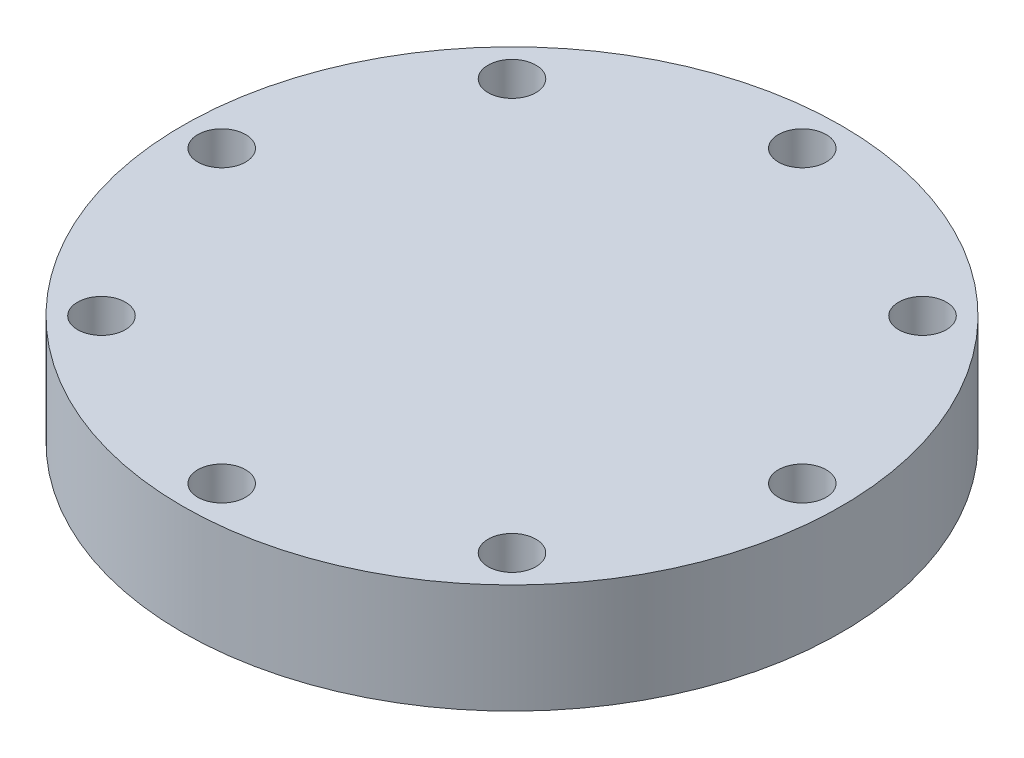
ISO-10303-21;
HEADER;
FILE_DESCRIPTION(('STEP AP214'),'2;1');
FILE_NAME('part.step','',(''),(''),'','','');
FILE_SCHEMA(('AUTOMOTIVE_DESIGN { 1 0 10303 214 1 1 1 1 }'));
ENDSEC;
DATA;
#1=APPLICATION_CONTEXT('core data for automotive mechanical design processes');
#2=APPLICATION_PROTOCOL_DEFINITION('international standard','automotive_design',2000,#1);
#3=PRODUCT_CONTEXT('',#1,'mechanical');
#4=PRODUCT('Part','Part','',(#3));
#5=PRODUCT_RELATED_PRODUCT_CATEGORY('part','',(#4));
#6=PRODUCT_DEFINITION_FORMATION('','',#4);
#7=PRODUCT_DEFINITION_CONTEXT('part definition',#1,'design');
#8=PRODUCT_DEFINITION('design','',#6,#7);
#9=PRODUCT_DEFINITION_SHAPE('','',#8);
#10=(LENGTH_UNIT() NAMED_UNIT(*) SI_UNIT(.MILLI.,.METRE.));
#11=(NAMED_UNIT(*) PLANE_ANGLE_UNIT() SI_UNIT($,.RADIAN.));
#12=(NAMED_UNIT(*) SI_UNIT($,.STERADIAN.) SOLID_ANGLE_UNIT());
#13=UNCERTAINTY_MEASURE_WITH_UNIT(LENGTH_MEASURE(1.E-05),#10,'distance_accuracy_value','');
#14=(GEOMETRIC_REPRESENTATION_CONTEXT(3) GLOBAL_UNCERTAINTY_ASSIGNED_CONTEXT((#13)) GLOBAL_UNIT_ASSIGNED_CONTEXT((#10,
#11,#12)) REPRESENTATION_CONTEXT('',''));
#15=CARTESIAN_POINT('',(0.,0.,0.));
#16=DIRECTION('',(0.,0.,1.));
#17=DIRECTION('',(1.,0.,0.));
#18=AXIS2_PLACEMENT_3D('',#15,#16,#17);
#19=CARTESIAN_POINT('',(-30.0520382004282,-8.00000000000001,30.0520382004283));
#20=DIRECTION('',(0.,1.,0.));
#21=DIRECTION('',(0.,0.,1.));
#22=AXIS2_PLACEMENT_3D('',#19,#20,#21);
#23=CYLINDRICAL_SURFACE('',#22,2.);
#24=CARTESIAN_POINT('',(-30.0520382004282,0.,30.0520382004283));
#25=DIRECTION('',(0.,1.,0.));
#26=DIRECTION('',(0.,0.,1.));
#27=AXIS2_PLACEMENT_3D('',#24,#25,#26);
#28=CIRCLE('',#27,2.);
#29=CARTESIAN_POINT('',(-30.0520382004282,0.,32.0520382004283));
#30=VERTEX_POINT('',#29);
#31=EDGE_CURVE('E57',#30,#30,#28,.T.);
#32=ORIENTED_EDGE('',*,*,#31,.F.);
#33=EDGE_LOOP('',(#32));
#34=FACE_BOUND('',#33,.T.);
#35=CARTESIAN_POINT('',(-30.0520382004282,6.,30.0520382004283));
#36=DIRECTION('',(0.,1.,0.));
#37=DIRECTION('',(0.,0.,1.));
#38=AXIS2_PLACEMENT_3D('',#35,#36,#37);
#39=CIRCLE('',#38,2.);
#40=CARTESIAN_POINT('',(-30.0520382004282,6.,32.0520382004283));
#41=VERTEX_POINT('',#40);
#42=EDGE_CURVE('E41',#41,#41,#39,.F.);
#43=ORIENTED_EDGE('',*,*,#42,.F.);
#44=EDGE_LOOP('',(#43));
#45=FACE_BOUND('',#44,.T.);
#46=ADVANCED_FACE('F37',(#34,#45),#23,.F.);
#47=CARTESIAN_POINT('',(-30.0520382004286,-8.00000000000001,-30.0520382004279));
#48=DIRECTION('',(0.,1.,0.));
#49=DIRECTION('',(0.,0.,1.));
#50=AXIS2_PLACEMENT_3D('',#47,#48,#49);
#51=CYLINDRICAL_SURFACE('',#50,2.);
#52=CARTESIAN_POINT('',(-30.0520382004286,0.,-30.0520382004279));
#53=DIRECTION('',(0.,1.,0.));
#54=DIRECTION('',(0.,0.,1.));
#55=AXIS2_PLACEMENT_3D('',#52,#53,#54);
#56=CIRCLE('',#55,2.);
#57=CARTESIAN_POINT('',(-30.0520382004286,0.,-28.0520382004279));
#58=VERTEX_POINT('',#57);
#59=EDGE_CURVE('E60',#58,#58,#56,.T.);
#60=ORIENTED_EDGE('',*,*,#59,.F.);
#61=EDGE_LOOP('',(#60));
#62=FACE_BOUND('',#61,.T.);
#63=CARTESIAN_POINT('',(-30.0520382004286,6.,-30.0520382004279));
#64=DIRECTION('',(0.,1.,0.));
#65=DIRECTION('',(0.,0.,1.));
#66=AXIS2_PLACEMENT_3D('',#63,#64,#65);
#67=CIRCLE('',#66,2.);
#68=CARTESIAN_POINT('',(-30.0520382004286,6.,-28.0520382004279));
#69=VERTEX_POINT('',#68);
#70=EDGE_CURVE('E96',#69,#69,#67,.F.);
#71=ORIENTED_EDGE('',*,*,#70,.F.);
#72=EDGE_LOOP('',(#71));
#73=FACE_BOUND('',#72,.T.);
#74=ADVANCED_FACE('F199',(#62,#73),#51,.F.);
#75=CARTESIAN_POINT('',(-4.451638707025E-13,-8.00000000000001,-42.5));
#76=DIRECTION('',(0.,1.,0.));
#77=DIRECTION('',(0.,0.,1.));
#78=AXIS2_PLACEMENT_3D('',#75,#76,#77);
#79=CYLINDRICAL_SURFACE('',#78,2.);
#80=CARTESIAN_POINT('',(-4.451638707025E-13,0.,-42.5));
#81=DIRECTION('',(0.,1.,0.));
#82=DIRECTION('',(0.,0.,1.));
#83=AXIS2_PLACEMENT_3D('',#80,#81,#82);
#84=CIRCLE('',#83,2.);
#85=CARTESIAN_POINT('',(-4.451638707025E-13,0.,-40.5));
#86=VERTEX_POINT('',#85);
#87=EDGE_CURVE('E64',#86,#86,#84,.T.);
#88=ORIENTED_EDGE('',*,*,#87,.F.);
#89=EDGE_LOOP('',(#88));
#90=FACE_BOUND('',#89,.T.);
#91=CARTESIAN_POINT('',(-4.451638707025E-13,6.,-42.5));
#92=DIRECTION('',(0.,1.,0.));
#93=DIRECTION('',(0.,0.,1.));
#94=AXIS2_PLACEMENT_3D('',#91,#92,#93);
#95=CIRCLE('',#94,2.);
#96=CARTESIAN_POINT('',(-4.451638707025E-13,6.,-40.5));
#97=VERTEX_POINT('',#96);
#98=EDGE_CURVE('E94',#97,#97,#95,.F.);
#99=ORIENTED_EDGE('',*,*,#98,.F.);
#100=EDGE_LOOP('',(#99));
#101=FACE_BOUND('',#100,.T.);
#102=ADVANCED_FACE('F206',(#90,#101),#79,.F.);
#103=CARTESIAN_POINT('',(30.052038200428,-8.00000000000001,-30.0520382004285));
#104=DIRECTION('',(0.,1.,0.));
#105=DIRECTION('',(0.,0.,1.));
#106=AXIS2_PLACEMENT_3D('',#103,#104,#105);
#107=CYLINDRICAL_SURFACE('',#106,2.);
#108=CARTESIAN_POINT('',(30.052038200428,0.,-30.0520382004285));
#109=DIRECTION('',(0.,1.,0.));
#110=DIRECTION('',(0.,0.,1.));
#111=AXIS2_PLACEMENT_3D('',#108,#109,#110);
#112=CIRCLE('',#111,2.);
#113=CARTESIAN_POINT('',(30.052038200428,0.,-28.0520382004285));
#114=VERTEX_POINT('',#113);
#115=EDGE_CURVE('E67',#114,#114,#112,.T.);
#116=ORIENTED_EDGE('',*,*,#115,.F.);
#117=EDGE_LOOP('',(#116));
#118=FACE_BOUND('',#117,.T.);
#119=CARTESIAN_POINT('',(30.052038200428,6.,-30.0520382004285));
#120=DIRECTION('',(0.,1.,0.));
#121=DIRECTION('',(0.,0.,1.));
#122=AXIS2_PLACEMENT_3D('',#119,#120,#121);
#123=CIRCLE('',#122,2.);
#124=CARTESIAN_POINT('',(30.052038200428,6.,-28.0520382004285));
#125=VERTEX_POINT('',#124);
#126=EDGE_CURVE('E91',#125,#125,#123,.F.);
#127=ORIENTED_EDGE('',*,*,#126,.F.);
#128=EDGE_LOOP('',(#127));
#129=FACE_BOUND('',#128,.T.);
#130=ADVANCED_FACE('F213',(#118,#129),#107,.F.);
#131=CARTESIAN_POINT('',(42.5,-8.00000000000001,0.));
#132=DIRECTION('',(0.,1.,0.));
#133=DIRECTION('',(0.,0.,1.));
#134=AXIS2_PLACEMENT_3D('',#131,#132,#133);
#135=CYLINDRICAL_SURFACE('',#134,2.);
#136=CARTESIAN_POINT('',(42.5,0.,0.));
#137=DIRECTION('',(0.,1.,0.));
#138=DIRECTION('',(0.,0.,1.));
#139=AXIS2_PLACEMENT_3D('',#136,#137,#138);
#140=CIRCLE('',#139,2.);
#141=CARTESIAN_POINT('',(42.5,0.,2.));
#142=VERTEX_POINT('',#141);
#143=EDGE_CURVE('E70',#142,#142,#140,.T.);
#144=ORIENTED_EDGE('',*,*,#143,.F.);
#145=EDGE_LOOP('',(#144));
#146=FACE_BOUND('',#145,.T.);
#147=CARTESIAN_POINT('',(42.5,6.,0.));
#148=DIRECTION('',(0.,1.,0.));
#149=DIRECTION('',(0.,0.,1.));
#150=AXIS2_PLACEMENT_3D('',#147,#148,#149);
#151=CIRCLE('',#150,2.);
#152=CARTESIAN_POINT('',(42.5,6.,2.));
#153=VERTEX_POINT('',#152);
#154=EDGE_CURVE('E88',#153,#153,#151,.F.);
#155=ORIENTED_EDGE('',*,*,#154,.F.);
#156=EDGE_LOOP('',(#155));
#157=FACE_BOUND('',#156,.T.);
#158=ADVANCED_FACE('F269',(#146,#157),#135,.F.);
#159=CARTESIAN_POINT('',(30.0520382004284,-8.00000000000001,30.0520382004281));
#160=DIRECTION('',(0.,1.,0.));
#161=DIRECTION('',(0.,0.,1.));
#162=AXIS2_PLACEMENT_3D('',#159,#160,#161);
#163=CYLINDRICAL_SURFACE('',#162,2.);
#164=CARTESIAN_POINT('',(30.0520382004284,0.,30.0520382004281));
#165=DIRECTION('',(0.,1.,0.));
#166=DIRECTION('',(0.,0.,1.));
#167=AXIS2_PLACEMENT_3D('',#164,#165,#166);
#168=CIRCLE('',#167,2.);
#169=CARTESIAN_POINT('',(30.0520382004284,0.,32.0520382004281));
#170=VERTEX_POINT('',#169);
#171=EDGE_CURVE('E73',#170,#170,#168,.T.);
#172=ORIENTED_EDGE('',*,*,#171,.F.);
#173=EDGE_LOOP('',(#172));
#174=FACE_BOUND('',#173,.T.);
#175=CARTESIAN_POINT('',(30.0520382004284,6.,30.0520382004281));
#176=DIRECTION('',(0.,1.,0.));
#177=DIRECTION('',(0.,0.,1.));
#178=AXIS2_PLACEMENT_3D('',#175,#176,#177);
#179=CIRCLE('',#178,2.);
#180=CARTESIAN_POINT('',(30.0520382004284,6.,32.0520382004281));
#181=VERTEX_POINT('',#180);
#182=EDGE_CURVE('E84',#181,#181,#179,.F.);
#183=ORIENTED_EDGE('',*,*,#182,.F.);
#184=EDGE_LOOP('',(#183));
#185=FACE_BOUND('',#184,.T.);
#186=ADVANCED_FACE('F266',(#174,#185),#163,.F.);
#187=CARTESIAN_POINT('',(1.48387956900833E-13,-8.00000000000001,42.5));
#188=DIRECTION('',(0.,1.,0.));
#189=DIRECTION('',(0.,0.,1.));
#190=AXIS2_PLACEMENT_3D('',#187,#188,#189);
#191=CYLINDRICAL_SURFACE('',#190,2.);
#192=CARTESIAN_POINT('',(1.48387956900833E-13,0.,42.5));
#193=DIRECTION('',(0.,1.,0.));
#194=DIRECTION('',(0.,0.,1.));
#195=AXIS2_PLACEMENT_3D('',#192,#193,#194);
#196=CIRCLE('',#195,2.);
#197=CARTESIAN_POINT('',(1.48387956900833E-13,0.,44.5));
#198=VERTEX_POINT('',#197);
#199=EDGE_CURVE('E56',#198,#198,#196,.T.);
#200=ORIENTED_EDGE('',*,*,#199,.F.);
#201=EDGE_LOOP('',(#200));
#202=FACE_BOUND('',#201,.T.);
#203=CARTESIAN_POINT('',(1.48387956900833E-13,6.,42.5));
#204=DIRECTION('',(0.,1.,0.));
#205=DIRECTION('',(0.,0.,1.));
#206=AXIS2_PLACEMENT_3D('',#203,#204,#205);
#207=CIRCLE('',#206,2.);
#208=CARTESIAN_POINT('',(1.48387956900833E-13,6.,44.5));
#209=VERTEX_POINT('',#208);
#210=EDGE_CURVE('E81',#209,#209,#207,.F.);
#211=ORIENTED_EDGE('',*,*,#210,.F.);
#212=EDGE_LOOP('',(#211));
#213=FACE_BOUND('',#212,.T.);
#214=ADVANCED_FACE('F219',(#202,#213),#191,.F.);
#215=CARTESIAN_POINT('',(-42.5,-8.00000000000001,0.));
#216=DIRECTION('',(0.,1.,0.));
#217=DIRECTION('',(0.,0.,1.));
#218=AXIS2_PLACEMENT_3D('',#215,#216,#217);
#219=CYLINDRICAL_SURFACE('',#218,2.);
#220=CARTESIAN_POINT('',(-42.5,0.,0.));
#221=DIRECTION('',(0.,1.,0.));
#222=DIRECTION('',(0.,0.,1.));
#223=AXIS2_PLACEMENT_3D('',#220,#221,#222);
#224=CIRCLE('',#223,2.);
#225=CARTESIAN_POINT('',(-42.5,0.,2.));
#226=VERTEX_POINT('',#225);
#227=EDGE_CURVE('E50',#226,#226,#224,.T.);
#228=ORIENTED_EDGE('',*,*,#227,.F.);
#229=EDGE_LOOP('',(#228));
#230=FACE_BOUND('',#229,.T.);
#231=CARTESIAN_POINT('',(-42.5,6.,0.));
#232=DIRECTION('',(0.,1.,0.));
#233=DIRECTION('',(0.,0.,1.));
#234=AXIS2_PLACEMENT_3D('',#231,#232,#233);
#235=CIRCLE('',#234,2.);
#236=CARTESIAN_POINT('',(-42.5,6.,2.));
#237=VERTEX_POINT('',#236);
#238=EDGE_CURVE('E61',#237,#237,#235,.F.);
#239=ORIENTED_EDGE('',*,*,#238,.F.);
#240=EDGE_LOOP('',(#239));
#241=FACE_BOUND('',#240,.T.);
#242=ADVANCED_FACE('F215',(#230,#241),#219,.F.);
#243=CARTESIAN_POINT('',(0.,0.,0.));
#244=DIRECTION('',(0.,1.,0.));
#245=DIRECTION('',(0.,0.,1.));
#246=AXIS2_PLACEMENT_3D('',#243,#244,#245);
#247=PLANE('',#246);
#248=ORIENTED_EDGE('',*,*,#199,.T.);
#249=EDGE_LOOP('',(#248));
#250=FACE_BOUND('',#249,.T.);
#251=ORIENTED_EDGE('',*,*,#171,.T.);
#252=EDGE_LOOP('',(#251));
#253=FACE_BOUND('',#252,.T.);
#254=ORIENTED_EDGE('',*,*,#143,.T.);
#255=EDGE_LOOP('',(#254));
#256=FACE_BOUND('',#255,.T.);
#257=ORIENTED_EDGE('',*,*,#115,.T.);
#258=EDGE_LOOP('',(#257));
#259=FACE_BOUND('',#258,.T.);
#260=ORIENTED_EDGE('',*,*,#87,.T.);
#261=EDGE_LOOP('',(#260));
#262=FACE_BOUND('',#261,.T.);
#263=ORIENTED_EDGE('',*,*,#59,.T.);
#264=EDGE_LOOP('',(#263));
#265=FACE_BOUND('',#264,.T.);
#266=ORIENTED_EDGE('',*,*,#31,.T.);
#267=EDGE_LOOP('',(#266));
#268=FACE_BOUND('',#267,.T.);
#269=ORIENTED_EDGE('',*,*,#227,.T.);
#270=EDGE_LOOP('',(#269));
#271=FACE_BOUND('',#270,.T.);
#272=CARTESIAN_POINT('',(0.,0.,0.));
#273=DIRECTION('',(0.,1.,0.));
#274=DIRECTION('',(0.,0.,1.));
#275=AXIS2_PLACEMENT_3D('',#272,#273,#274);
#276=CIRCLE('',#275,48.25);
#277=CARTESIAN_POINT('',(0.,0.,48.25));
#278=VERTEX_POINT('',#277);
#279=EDGE_CURVE('E10',#278,#278,#276,.T.);
#280=ORIENTED_EDGE('',*,*,#279,.F.);
#281=EDGE_LOOP('',(#280));
#282=FACE_BOUND('',#281,.T.);
#283=CARTESIAN_POINT('',(0.,0.,0.));
#284=DIRECTION('',(0.,1.,0.));
#285=DIRECTION('',(0.,0.,1.));
#286=AXIS2_PLACEMENT_3D('',#283,#284,#285);
#287=CIRCLE('',#286,36.);
#288=CARTESIAN_POINT('',(0.,0.,36.));
#289=VERTEX_POINT('',#288);
#290=EDGE_CURVE('E45',#289,#289,#287,.T.);
#291=ORIENTED_EDGE('',*,*,#290,.T.);
#292=EDGE_LOOP('',(#291));
#293=FACE_BOUND('',#292,.T.);
#294=ADVANCED_FACE('F218',(#250,#253,#256,#259,#262,#265,#268,#271,#282,#293),#247,.F.);
#295=CARTESIAN_POINT('',(0.,10.,0.));
#296=DIRECTION('',(0.,-1.,0.));
#297=DIRECTION('',(0.,0.,-1.));
#298=AXIS2_PLACEMENT_3D('',#295,#296,#297);
#299=CYLINDRICAL_SURFACE('',#298,48.25);
#300=ORIENTED_EDGE('',*,*,#279,.T.);
#301=EDGE_LOOP('',(#300));
#302=FACE_BOUND('',#301,.T.);
#303=CARTESIAN_POINT('',(0.,16.,0.));
#304=DIRECTION('',(0.,1.,0.));
#305=DIRECTION('',(0.,0.,1.));
#306=AXIS2_PLACEMENT_3D('',#303,#304,#305);
#307=CIRCLE('',#306,48.25);
#308=CARTESIAN_POINT('',(0.,16.,48.25));
#309=VERTEX_POINT('',#308);
#310=EDGE_CURVE('E112',#309,#309,#307,.T.);
#311=ORIENTED_EDGE('',*,*,#310,.F.);
#312=EDGE_LOOP('',(#311));
#313=FACE_BOUND('',#312,.T.);
#314=ADVANCED_FACE('F39',(#302,#313),#299,.T.);
#315=CARTESIAN_POINT('',(0.,10.,0.));
#316=DIRECTION('',(0.,-1.,0.));
#317=DIRECTION('',(0.,0.,-1.));
#318=AXIS2_PLACEMENT_3D('',#315,#316,#317);
#319=CYLINDRICAL_SURFACE('',#318,36.);
#320=CARTESIAN_POINT('',(0.,10.,0.));
#321=DIRECTION('',(0.,1.,0.));
#322=DIRECTION('',(0.,0.,1.));
#323=AXIS2_PLACEMENT_3D('',#320,#321,#322);
#324=CIRCLE('',#323,36.);
#325=CARTESIAN_POINT('',(0.,10.,36.));
#326=VERTEX_POINT('',#325);
#327=EDGE_CURVE('E109',#326,#326,#324,.T.);
#328=ORIENTED_EDGE('',*,*,#327,.T.);
#329=EDGE_LOOP('',(#328));
#330=FACE_BOUND('',#329,.T.);
#331=ORIENTED_EDGE('',*,*,#290,.F.);
#332=EDGE_LOOP('',(#331));
#333=FACE_BOUND('',#332,.T.);
#334=ADVANCED_FACE('F221',(#330,#333),#319,.F.);
#335=CARTESIAN_POINT('',(-42.5,6.,0.));
#336=DIRECTION('',(0.,1.,0.));
#337=DIRECTION('',(0.,0.,1.));
#338=AXIS2_PLACEMENT_3D('',#335,#336,#337);
#339=PLANE('',#338);
#340=CARTESIAN_POINT('',(-42.5,6.,0.));
#341=DIRECTION('',(0.,1.,0.));
#342=DIRECTION('',(0.,0.,1.));
#343=AXIS2_PLACEMENT_3D('',#340,#341,#342);
#344=CIRCLE('',#343,3.5);
#345=CARTESIAN_POINT('',(-42.5,6.,3.5));
#346=VERTEX_POINT('',#345);
#347=EDGE_CURVE('E80',#346,#346,#344,.T.);
#348=ORIENTED_EDGE('',*,*,#347,.T.);
#349=EDGE_LOOP('',(#348));
#350=FACE_BOUND('',#349,.T.);
#351=ORIENTED_EDGE('',*,*,#238,.T.);
#352=EDGE_LOOP('',(#351));
#353=FACE_BOUND('',#352,.T.);
#354=ADVANCED_FACE('F223',(#350,#353),#339,.T.);
#355=CARTESIAN_POINT('',(-42.5,6.,0.));
#356=DIRECTION('',(0.,1.,0.));
#357=DIRECTION('',(0.,0.,1.));
#358=AXIS2_PLACEMENT_3D('',#355,#356,#357);
#359=CYLINDRICAL_SURFACE('',#358,3.5);
#360=ORIENTED_EDGE('',*,*,#347,.F.);
#361=EDGE_LOOP('',(#360));
#362=FACE_BOUND('',#361,.T.);
#363=CARTESIAN_POINT('',(-42.5,16.,0.));
#364=DIRECTION('',(0.,-1.,0.));
#365=DIRECTION('',(0.,0.,-1.));
#366=AXIS2_PLACEMENT_3D('',#363,#364,#365);
#367=CIRCLE('',#366,3.5);
#368=CARTESIAN_POINT('',(-42.5,16.,-3.5));
#369=VERTEX_POINT('',#368);
#370=EDGE_CURVE('E119',#369,#369,#367,.T.);
#371=ORIENTED_EDGE('',*,*,#370,.F.);
#372=EDGE_LOOP('',(#371));
#373=FACE_BOUND('',#372,.T.);
#374=ADVANCED_FACE('F250',(#362,#373),#359,.F.);
#375=CARTESIAN_POINT('',(-4.451638707025E-13,6.,42.5));
#376=DIRECTION('',(0.,1.,0.));
#377=DIRECTION('',(1.,0.,0.));
#378=AXIS2_PLACEMENT_3D('',#375,#376,#377);
#379=PLANE('',#378);
#380=CARTESIAN_POINT('',(-4.451638707025E-13,6.,42.5));
#381=DIRECTION('',(0.,1.,0.));
#382=DIRECTION('',(1.,0.,0.));
#383=AXIS2_PLACEMENT_3D('',#380,#381,#382);
#384=CIRCLE('',#383,3.5);
#385=CARTESIAN_POINT('',(3.49999999999956,6.,42.5));
#386=VERTEX_POINT('',#385);
#387=EDGE_CURVE('E116',#386,#386,#384,.T.);
#388=ORIENTED_EDGE('',*,*,#387,.T.);
#389=EDGE_LOOP('',(#388));
#390=FACE_BOUND('',#389,.T.);
#391=ORIENTED_EDGE('',*,*,#210,.T.);
#392=EDGE_LOOP('',(#391));
#393=FACE_BOUND('',#392,.T.);
#394=ADVANCED_FACE('F255',(#390,#393),#379,.T.);
#395=CARTESIAN_POINT('',(-4.451638707025E-13,6.,42.5));
#396=DIRECTION('',(0.,1.,0.));
#397=DIRECTION('',(0.,0.,1.));
#398=AXIS2_PLACEMENT_3D('',#395,#396,#397);
#399=CYLINDRICAL_SURFACE('',#398,3.5);
#400=ORIENTED_EDGE('',*,*,#387,.F.);
#401=EDGE_LOOP('',(#400));
#402=FACE_BOUND('',#401,.T.);
#403=CARTESIAN_POINT('',(-4.451638707025E-13,16.,42.5));
#404=DIRECTION('',(0.,-1.,0.));
#405=DIRECTION('',(-1.,0.,0.));
#406=AXIS2_PLACEMENT_3D('',#403,#404,#405);
#407=CIRCLE('',#406,3.5);
#408=CARTESIAN_POINT('',(-3.50000000000044,16.,42.5));
#409=VERTEX_POINT('',#408);
#410=EDGE_CURVE('E155',#409,#409,#407,.T.);
#411=ORIENTED_EDGE('',*,*,#410,.F.);
#412=EDGE_LOOP('',(#411));
#413=FACE_BOUND('',#412,.T.);
#414=ADVANCED_FACE('F296',(#402,#413),#399,.F.);
#415=CARTESIAN_POINT('',(30.052038200428,6.,30.0520382004285));
#416=DIRECTION('',(0.,1.,0.));
#417=DIRECTION('',(0.707106781186554,0.,-0.707106781186541));
#418=AXIS2_PLACEMENT_3D('',#415,#416,#417);
#419=PLANE('',#418);
#420=CARTESIAN_POINT('',(30.052038200428,6.,30.0520382004285));
#421=DIRECTION('',(0.,1.,0.));
#422=DIRECTION('',(0.707106781186554,0.,-0.707106781186541));
#423=AXIS2_PLACEMENT_3D('',#420,#421,#422);
#424=CIRCLE('',#423,3.5);
#425=CARTESIAN_POINT('',(32.5269119345809,6.,27.5771644662756));
#426=VERTEX_POINT('',#425);
#427=EDGE_CURVE('E129',#426,#426,#424,.T.);
#428=ORIENTED_EDGE('',*,*,#427,.T.);
#429=EDGE_LOOP('',(#428));
#430=FACE_BOUND('',#429,.T.);
#431=ORIENTED_EDGE('',*,*,#182,.T.);
#432=EDGE_LOOP('',(#431));
#433=FACE_BOUND('',#432,.T.);
#434=ADVANCED_FACE('F142',(#430,#433),#419,.T.);
#435=CARTESIAN_POINT('',(30.052038200428,6.,30.0520382004285));
#436=DIRECTION('',(0.,1.,0.));
#437=DIRECTION('',(0.,0.,1.));
#438=AXIS2_PLACEMENT_3D('',#435,#436,#437);
#439=CYLINDRICAL_SURFACE('',#438,3.5);
#440=ORIENTED_EDGE('',*,*,#427,.F.);
#441=EDGE_LOOP('',(#440));
#442=FACE_BOUND('',#441,.T.);
#443=CARTESIAN_POINT('',(30.052038200428,16.,30.0520382004285));
#444=DIRECTION('',(0.,-1.,0.));
#445=DIRECTION('',(-0.707106781186554,0.,0.707106781186541));
#446=AXIS2_PLACEMENT_3D('',#443,#444,#445);
#447=CIRCLE('',#446,3.5);
#448=CARTESIAN_POINT('',(27.5771644662751,16.,32.5269119345814));
#449=VERTEX_POINT('',#448);
#450=EDGE_CURVE('E152',#449,#449,#447,.T.);
#451=ORIENTED_EDGE('',*,*,#450,.F.);
#452=EDGE_LOOP('',(#451));
#453=FACE_BOUND('',#452,.T.);
#454=ADVANCED_FACE('F145',(#442,#453),#439,.F.);
#455=CARTESIAN_POINT('',(42.5,6.,0.));
#456=DIRECTION('',(0.,1.,0.));
#457=DIRECTION('',(0.,0.,-1.));
#458=AXIS2_PLACEMENT_3D('',#455,#456,#457);
#459=PLANE('',#458);
#460=CARTESIAN_POINT('',(42.5,6.,0.));
#461=DIRECTION('',(0.,1.,0.));
#462=DIRECTION('',(0.,0.,-1.));
#463=AXIS2_PLACEMENT_3D('',#460,#461,#462);
#464=CIRCLE('',#463,3.5);
#465=CARTESIAN_POINT('',(42.5,6.,-3.5));
#466=VERTEX_POINT('',#465);
#467=EDGE_CURVE('E137',#466,#466,#464,.T.);
#468=ORIENTED_EDGE('',*,*,#467,.T.);
#469=EDGE_LOOP('',(#468));
#470=FACE_BOUND('',#469,.T.);
#471=ORIENTED_EDGE('',*,*,#154,.T.);
#472=EDGE_LOOP('',(#471));
#473=FACE_BOUND('',#472,.T.);
#474=ADVANCED_FACE('F148',(#470,#473),#459,.T.);
#475=CARTESIAN_POINT('',(42.5,6.,0.));
#476=DIRECTION('',(0.,1.,0.));
#477=DIRECTION('',(0.,0.,1.));
#478=AXIS2_PLACEMENT_3D('',#475,#476,#477);
#479=CYLINDRICAL_SURFACE('',#478,3.5);
#480=ORIENTED_EDGE('',*,*,#467,.F.);
#481=EDGE_LOOP('',(#480));
#482=FACE_BOUND('',#481,.T.);
#483=CARTESIAN_POINT('',(42.5,16.,0.));
#484=DIRECTION('',(0.,-1.,0.));
#485=DIRECTION('',(0.,0.,1.));
#486=AXIS2_PLACEMENT_3D('',#483,#484,#485);
#487=CIRCLE('',#486,3.5);
#488=CARTESIAN_POINT('',(42.5,16.,3.5));
#489=VERTEX_POINT('',#488);
#490=EDGE_CURVE('E154',#489,#489,#487,.T.);
#491=ORIENTED_EDGE('',*,*,#490,.F.);
#492=EDGE_LOOP('',(#491));
#493=FACE_BOUND('',#492,.T.);
#494=ADVANCED_FACE('F281',(#482,#493),#479,.F.);
#495=CARTESIAN_POINT('',(30.0520382004284,6.,-30.0520382004281));
#496=DIRECTION('',(0.,1.,0.));
#497=DIRECTION('',(-0.707106781186544,0.,-0.707106781186551));
#498=AXIS2_PLACEMENT_3D('',#495,#496,#497);
#499=PLANE('',#498);
#500=CARTESIAN_POINT('',(30.0520382004284,6.,-30.0520382004281));
#501=DIRECTION('',(0.,1.,0.));
#502=DIRECTION('',(-0.707106781186544,0.,-0.707106781186551));
#503=AXIS2_PLACEMENT_3D('',#500,#501,#502);
#504=CIRCLE('',#503,3.5);
#505=CARTESIAN_POINT('',(27.5771644662755,6.,-32.526911934581));
#506=VERTEX_POINT('',#505);
#507=EDGE_CURVE('E134',#506,#506,#504,.T.);
#508=ORIENTED_EDGE('',*,*,#507,.T.);
#509=EDGE_LOOP('',(#508));
#510=FACE_BOUND('',#509,.T.);
#511=ORIENTED_EDGE('',*,*,#126,.T.);
#512=EDGE_LOOP('',(#511));
#513=FACE_BOUND('',#512,.T.);
#514=ADVANCED_FACE('F289',(#510,#513),#499,.T.);
#515=CARTESIAN_POINT('',(30.0520382004284,6.,-30.0520382004281));
#516=DIRECTION('',(0.,1.,0.));
#517=DIRECTION('',(0.,0.,1.));
#518=AXIS2_PLACEMENT_3D('',#515,#516,#517);
#519=CYLINDRICAL_SURFACE('',#518,3.5);
#520=ORIENTED_EDGE('',*,*,#507,.F.);
#521=EDGE_LOOP('',(#520));
#522=FACE_BOUND('',#521,.T.);
#523=CARTESIAN_POINT('',(30.0520382004284,16.,-30.0520382004281));
#524=DIRECTION('',(0.,-1.,0.));
#525=DIRECTION('',(0.707106781186544,0.,0.707106781186551));
#526=AXIS2_PLACEMENT_3D('',#523,#524,#525);
#527=CIRCLE('',#526,3.5);
#528=CARTESIAN_POINT('',(32.5269119345813,16.,-27.5771644662752));
#529=VERTEX_POINT('',#528);
#530=EDGE_CURVE('E158',#529,#529,#527,.T.);
#531=ORIENTED_EDGE('',*,*,#530,.F.);
#532=EDGE_LOOP('',(#531));
#533=FACE_BOUND('',#532,.T.);
#534=ADVANCED_FACE('F293',(#522,#533),#519,.F.);
#535=CARTESIAN_POINT('',(1.48387956900833E-13,6.,-42.5));
#536=DIRECTION('',(0.,1.,0.));
#537=DIRECTION('',(-1.,0.,0.));
#538=AXIS2_PLACEMENT_3D('',#535,#536,#537);
#539=PLANE('',#538);
#540=CARTESIAN_POINT('',(1.48387956900833E-13,6.,-42.5));
#541=DIRECTION('',(0.,1.,0.));
#542=DIRECTION('',(-1.,0.,0.));
#543=AXIS2_PLACEMENT_3D('',#540,#541,#542);
#544=CIRCLE('',#543,3.5);
#545=CARTESIAN_POINT('',(-3.49999999999985,6.,-42.5));
#546=VERTEX_POINT('',#545);
#547=EDGE_CURVE('E131',#546,#546,#544,.T.);
#548=ORIENTED_EDGE('',*,*,#547,.T.);
#549=EDGE_LOOP('',(#548));
#550=FACE_BOUND('',#549,.T.);
#551=ORIENTED_EDGE('',*,*,#98,.T.);
#552=EDGE_LOOP('',(#551));
#553=FACE_BOUND('',#552,.T.);
#554=ADVANCED_FACE('F306',(#550,#553),#539,.T.);
#555=CARTESIAN_POINT('',(1.48387956900833E-13,6.,-42.5));
#556=DIRECTION('',(0.,1.,0.));
#557=DIRECTION('',(0.,0.,1.));
#558=AXIS2_PLACEMENT_3D('',#555,#556,#557);
#559=CYLINDRICAL_SURFACE('',#558,3.5);
#560=ORIENTED_EDGE('',*,*,#547,.F.);
#561=EDGE_LOOP('',(#560));
#562=FACE_BOUND('',#561,.T.);
#563=CARTESIAN_POINT('',(1.48387956900833E-13,16.,-42.5));
#564=DIRECTION('',(0.,-1.,0.));
#565=DIRECTION('',(1.,0.,0.));
#566=AXIS2_PLACEMENT_3D('',#563,#564,#565);
#567=CIRCLE('',#566,3.5);
#568=CARTESIAN_POINT('',(3.50000000000015,16.,-42.5));
#569=VERTEX_POINT('',#568);
#570=EDGE_CURVE('E165',#569,#569,#567,.T.);
#571=ORIENTED_EDGE('',*,*,#570,.F.);
#572=EDGE_LOOP('',(#571));
#573=FACE_BOUND('',#572,.T.);
#574=ADVANCED_FACE('F299',(#562,#573),#559,.F.);
#575=CARTESIAN_POINT('',(-30.0520382004282,6.,-30.0520382004283));
#576=DIRECTION('',(0.,1.,0.));
#577=DIRECTION('',(-0.707106781186549,0.,0.707106781186546));
#578=AXIS2_PLACEMENT_3D('',#575,#576,#577);
#579=PLANE('',#578);
#580=CARTESIAN_POINT('',(-30.0520382004282,6.,-30.0520382004283));
#581=DIRECTION('',(0.,1.,0.));
#582=DIRECTION('',(-0.707106781186549,0.,0.707106781186546));
#583=AXIS2_PLACEMENT_3D('',#580,#581,#582);
#584=CIRCLE('',#583,3.5);
#585=CARTESIAN_POINT('',(-32.5269119345811,6.,-27.5771644662754));
#586=VERTEX_POINT('',#585);
#587=EDGE_CURVE('E85',#586,#586,#584,.T.);
#588=ORIENTED_EDGE('',*,*,#587,.T.);
#589=EDGE_LOOP('',(#588));
#590=FACE_BOUND('',#589,.T.);
#591=ORIENTED_EDGE('',*,*,#70,.T.);
#592=EDGE_LOOP('',(#591));
#593=FACE_BOUND('',#592,.T.);
#594=ADVANCED_FACE('F297',(#590,#593),#579,.T.);
#595=CARTESIAN_POINT('',(-30.0520382004282,6.,-30.0520382004283));
#596=DIRECTION('',(0.,1.,0.));
#597=DIRECTION('',(0.,0.,1.));
#598=AXIS2_PLACEMENT_3D('',#595,#596,#597);
#599=CYLINDRICAL_SURFACE('',#598,3.5);
#600=ORIENTED_EDGE('',*,*,#587,.F.);
#601=EDGE_LOOP('',(#600));
#602=FACE_BOUND('',#601,.T.);
#603=CARTESIAN_POINT('',(-30.0520382004282,16.,-30.0520382004283));
#604=DIRECTION('',(0.,-1.,0.));
#605=DIRECTION('',(0.707106781186549,0.,-0.707106781186546));
#606=AXIS2_PLACEMENT_3D('',#603,#604,#605);
#607=CIRCLE('',#606,3.5);
#608=CARTESIAN_POINT('',(-27.5771644662753,16.,-32.5269119345812));
#609=VERTEX_POINT('',#608);
#610=EDGE_CURVE('E124',#609,#609,#607,.T.);
#611=ORIENTED_EDGE('',*,*,#610,.F.);
#612=EDGE_LOOP('',(#611));
#613=FACE_BOUND('',#612,.T.);
#614=ADVANCED_FACE('F193',(#602,#613),#599,.F.);
#615=CARTESIAN_POINT('',(-30.0520382004286,6.,30.0520382004279));
#616=DIRECTION('',(0.,1.,0.));
#617=DIRECTION('',(0.707106781186539,0.,0.707106781186556));
#618=AXIS2_PLACEMENT_3D('',#615,#616,#617);
#619=PLANE('',#618);
#620=CARTESIAN_POINT('',(-30.0520382004286,6.,30.0520382004279));
#621=DIRECTION('',(0.,1.,0.));
#622=DIRECTION('',(0.707106781186539,0.,0.707106781186556));
#623=AXIS2_PLACEMENT_3D('',#620,#621,#622);
#624=CIRCLE('',#623,3.5);
#625=CARTESIAN_POINT('',(-27.5771644662758,6.,32.5269119345809));
#626=VERTEX_POINT('',#625);
#627=EDGE_CURVE('E111',#626,#626,#624,.T.);
#628=ORIENTED_EDGE('',*,*,#627,.T.);
#629=EDGE_LOOP('',(#628));
#630=FACE_BOUND('',#629,.T.);
#631=ORIENTED_EDGE('',*,*,#42,.T.);
#632=EDGE_LOOP('',(#631));
#633=FACE_BOUND('',#632,.T.);
#634=ADVANCED_FACE('F182',(#630,#633),#619,.T.);
#635=CARTESIAN_POINT('',(-30.0520382004286,6.,30.0520382004279));
#636=DIRECTION('',(0.,1.,0.));
#637=DIRECTION('',(0.,0.,1.));
#638=AXIS2_PLACEMENT_3D('',#635,#636,#637);
#639=CYLINDRICAL_SURFACE('',#638,3.5);
#640=ORIENTED_EDGE('',*,*,#627,.F.);
#641=EDGE_LOOP('',(#640));
#642=FACE_BOUND('',#641,.T.);
#643=CARTESIAN_POINT('',(-30.0520382004286,16.,30.0520382004279));
#644=DIRECTION('',(0.,-1.,0.));
#645=DIRECTION('',(-0.707106781186539,0.,-0.707106781186556));
#646=AXIS2_PLACEMENT_3D('',#643,#644,#645);
#647=CIRCLE('',#646,3.5);
#648=CARTESIAN_POINT('',(-32.5269119345815,16.,27.577164466275));
#649=VERTEX_POINT('',#648);
#650=EDGE_CURVE('E161',#649,#649,#647,.T.);
#651=ORIENTED_EDGE('',*,*,#650,.F.);
#652=EDGE_LOOP('',(#651));
#653=FACE_BOUND('',#652,.T.);
#654=ADVANCED_FACE('F179',(#642,#653),#639,.F.);
#655=CARTESIAN_POINT('',(0.,10.,0.));
#656=DIRECTION('',(0.,1.,0.));
#657=DIRECTION('',(0.,0.,1.));
#658=AXIS2_PLACEMENT_3D('',#655,#656,#657);
#659=PLANE('',#658);
#660=ORIENTED_EDGE('',*,*,#327,.F.);
#661=EDGE_LOOP('',(#660));
#662=FACE_BOUND('',#661,.T.);
#663=ADVANCED_FACE('F181',(#662),#659,.F.);
#664=CARTESIAN_POINT('',(0.,16.,0.));
#665=DIRECTION('',(0.,1.,0.));
#666=DIRECTION('',(0.,0.,1.));
#667=AXIS2_PLACEMENT_3D('',#664,#665,#666);
#668=PLANE('',#667);
#669=ORIENTED_EDGE('',*,*,#570,.T.);
#670=EDGE_LOOP('',(#669));
#671=FACE_BOUND('',#670,.T.);
#672=ORIENTED_EDGE('',*,*,#530,.T.);
#673=EDGE_LOOP('',(#672));
#674=FACE_BOUND('',#673,.T.);
#675=ORIENTED_EDGE('',*,*,#490,.T.);
#676=EDGE_LOOP('',(#675));
#677=FACE_BOUND('',#676,.T.);
#678=ORIENTED_EDGE('',*,*,#450,.T.);
#679=EDGE_LOOP('',(#678));
#680=FACE_BOUND('',#679,.T.);
#681=ORIENTED_EDGE('',*,*,#410,.T.);
#682=EDGE_LOOP('',(#681));
#683=FACE_BOUND('',#682,.T.);
#684=ORIENTED_EDGE('',*,*,#650,.T.);
#685=EDGE_LOOP('',(#684));
#686=FACE_BOUND('',#685,.T.);
#687=ORIENTED_EDGE('',*,*,#610,.T.);
#688=EDGE_LOOP('',(#687));
#689=FACE_BOUND('',#688,.T.);
#690=ORIENTED_EDGE('',*,*,#370,.T.);
#691=EDGE_LOOP('',(#690));
#692=FACE_BOUND('',#691,.T.);
#693=ORIENTED_EDGE('',*,*,#310,.T.);
#694=EDGE_LOOP('',(#693));
#695=FACE_BOUND('',#694,.T.);
#696=ADVANCED_FACE('F177',(#671,#674,#677,#680,#683,#686,#689,#692,#695),#668,.T.);
#697=CLOSED_SHELL('',(#46,#74,#102,#130,#158,#186,#214,#242,#294,#314,#334,#354,#374,#394,#414,
#434,#454,#474,#494,#514,#534,#554,#574,#594,#614,#634,#654,#663,#696));
#698=MANIFOLD_SOLID_BREP('B2',#697);
#699=ADVANCED_BREP_SHAPE_REPRESENTATION('',(#18,#698),#14);
#700=SHAPE_DEFINITION_REPRESENTATION(#9,#699);
ENDSEC;
END-ISO-10303-21;
